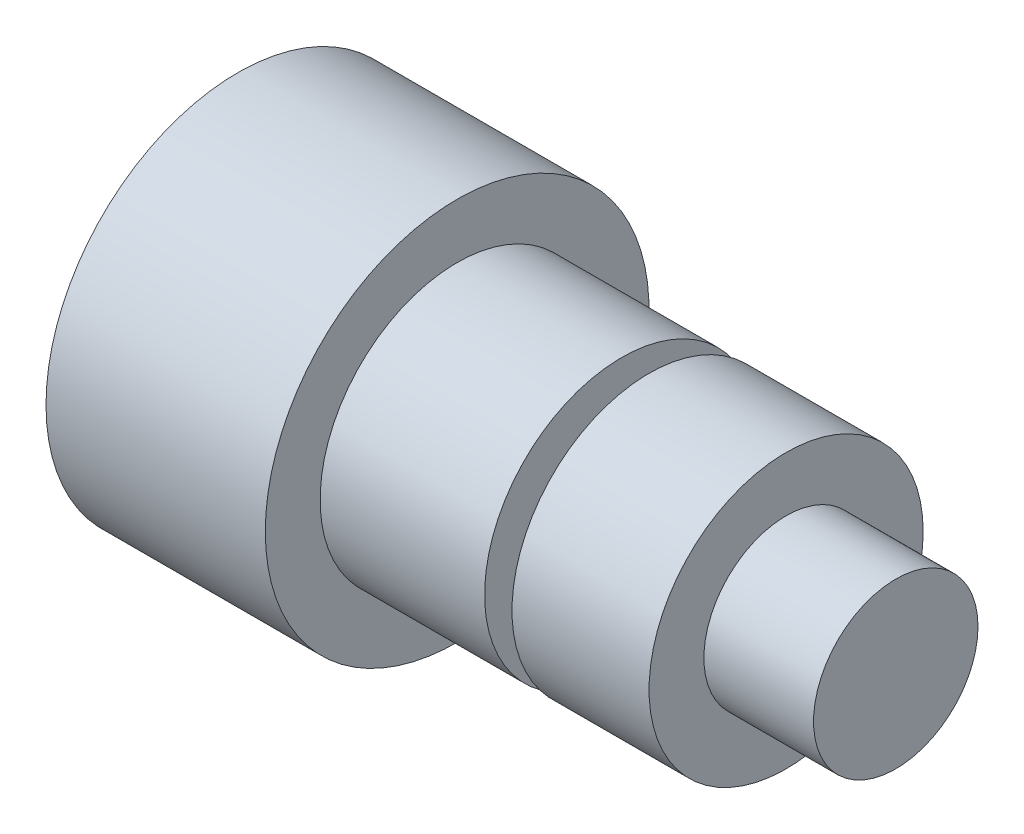
ISO-10303-21;
HEADER;
FILE_DESCRIPTION(('STEP AP214'),'2;1');
FILE_NAME('part.step','',(''),(''),'','','');
FILE_SCHEMA(('AUTOMOTIVE_DESIGN { 1 0 10303 214 1 1 1 1 }'));
ENDSEC;
DATA;
#1=APPLICATION_CONTEXT('core data for automotive mechanical design processes');
#2=APPLICATION_PROTOCOL_DEFINITION('international standard','automotive_design',2000,#1);
#3=PRODUCT_CONTEXT('',#1,'mechanical');
#4=PRODUCT('Part','Part','',(#3));
#5=PRODUCT_RELATED_PRODUCT_CATEGORY('part','',(#4));
#6=PRODUCT_DEFINITION_FORMATION('','',#4);
#7=PRODUCT_DEFINITION_CONTEXT('part definition',#1,'design');
#8=PRODUCT_DEFINITION('design','',#6,#7);
#9=PRODUCT_DEFINITION_SHAPE('','',#8);
#10=(LENGTH_UNIT() NAMED_UNIT(*) SI_UNIT(.MILLI.,.METRE.));
#11=(NAMED_UNIT(*) PLANE_ANGLE_UNIT() SI_UNIT($,.RADIAN.));
#12=(NAMED_UNIT(*) SI_UNIT($,.STERADIAN.) SOLID_ANGLE_UNIT());
#13=UNCERTAINTY_MEASURE_WITH_UNIT(LENGTH_MEASURE(1.E-05),#10,'distance_accuracy_value','');
#14=(GEOMETRIC_REPRESENTATION_CONTEXT(3) GLOBAL_UNCERTAINTY_ASSIGNED_CONTEXT((#13)) GLOBAL_UNIT_ASSIGNED_CONTEXT((#10,
#11,#12)) REPRESENTATION_CONTEXT('',''));
#15=CARTESIAN_POINT('',(0.,0.,0.));
#16=DIRECTION('',(0.,0.,1.));
#17=DIRECTION('',(1.,0.,0.));
#18=AXIS2_PLACEMENT_3D('',#15,#16,#17);
#19=CARTESIAN_POINT('',(0.,0.,0.));
#20=DIRECTION('',(1.,0.,0.));
#21=DIRECTION('',(0.,0.,-1.));
#22=AXIS2_PLACEMENT_3D('',#19,#20,#21);
#23=CYLINDRICAL_SURFACE('',#22,31.75);
#24=CARTESIAN_POINT('',(95.25,0.,0.));
#25=DIRECTION('',(1.,0.,0.));
#26=DIRECTION('',(0.,0.,-1.));
#27=AXIS2_PLACEMENT_3D('',#24,#25,#26);
#28=CIRCLE('',#27,31.75);
#29=CARTESIAN_POINT('',(95.25,0.,-31.75));
#30=VERTEX_POINT('',#29);
#31=EDGE_CURVE('E51',#30,#30,#28,.F.);
#32=ORIENTED_EDGE('',*,*,#31,.F.);
#33=EDGE_LOOP('',(#32));
#34=FACE_BOUND('',#33,.T.);
#35=CARTESIAN_POINT('',(127.,0.,0.));
#36=DIRECTION('',(1.,0.,0.));
#37=DIRECTION('',(0.,0.,-1.));
#38=AXIS2_PLACEMENT_3D('',#35,#36,#37);
#39=CIRCLE('',#38,31.75);
#40=CARTESIAN_POINT('',(127.,0.,-31.75));
#41=VERTEX_POINT('',#40);
#42=EDGE_CURVE('E54',#41,#41,#39,.F.);
#43=ORIENTED_EDGE('',*,*,#42,.T.);
#44=EDGE_LOOP('',(#43));
#45=FACE_BOUND('',#44,.T.);
#46=ADVANCED_FACE('F30',(#34,#45),#23,.T.);
#47=CARTESIAN_POINT('',(50.8,0.,0.));
#48=DIRECTION('',(1.,0.,0.));
#49=DIRECTION('',(0.,0.,-1.));
#50=AXIS2_PLACEMENT_3D('',#47,#48,#49);
#51=CIRCLE('',#50,31.75);
#52=CARTESIAN_POINT('',(50.8,0.,-31.75));
#53=VERTEX_POINT('',#52);
#54=EDGE_CURVE('E43',#53,#53,#51,.T.);
#55=ORIENTED_EDGE('',*,*,#54,.T.);
#56=EDGE_LOOP('',(#55));
#57=FACE_BOUND('',#56,.T.);
#58=CARTESIAN_POINT('',(88.9,0.,0.));
#59=DIRECTION('',(1.,0.,0.));
#60=DIRECTION('',(0.,0.,-1.));
#61=AXIS2_PLACEMENT_3D('',#58,#59,#60);
#62=CIRCLE('',#61,31.75);
#63=CARTESIAN_POINT('',(88.9,0.,-31.75));
#64=VERTEX_POINT('',#63);
#65=EDGE_CURVE('E48',#64,#64,#62,.F.);
#66=ORIENTED_EDGE('',*,*,#65,.T.);
#67=EDGE_LOOP('',(#66));
#68=FACE_BOUND('',#67,.T.);
#69=ADVANCED_FACE('F88',(#57,#68),#23,.T.);
#70=CARTESIAN_POINT('',(152.4,0.,0.));
#71=DIRECTION('',(-1.,0.,0.));
#72=DIRECTION('',(0.,0.,1.));
#73=AXIS2_PLACEMENT_3D('',#70,#71,#72);
#74=CYLINDRICAL_SURFACE('',#73,44.45);
#75=CARTESIAN_POINT('',(50.8,0.,0.));
#76=DIRECTION('',(-1.,0.,0.));
#77=DIRECTION('',(0.,0.,1.));
#78=AXIS2_PLACEMENT_3D('',#75,#76,#77);
#79=CIRCLE('',#78,44.45);
#80=CARTESIAN_POINT('',(50.8,0.,44.45));
#81=VERTEX_POINT('',#80);
#82=EDGE_CURVE('E38',#81,#81,#79,.T.);
#83=CARTESIAN_POINT('',(0.,0.,0.));
#84=DIRECTION('',(1.,0.,0.));
#85=DIRECTION('',(0.,0.,-1.));
#86=AXIS2_PLACEMENT_3D('',#83,#84,#85);
#87=CIRCLE('',#86,44.45);
#88=CARTESIAN_POINT('',(0.,0.,44.45));
#89=VERTEX_POINT('',#88);
#90=EDGE_CURVE('E10',#89,#89,#87,.T.);
#91=CARTESIAN_POINT('',(50.8,0.,44.45));
#92=CARTESIAN_POINT('',(50.2708333333334,0.,44.45));
#93=CARTESIAN_POINT('',(49.7416666666667,0.,44.45));
#94=CARTESIAN_POINT('',(48.6833333333334,0.,44.45));
#95=CARTESIAN_POINT('',(48.1541666666667,0.,44.45));
#96=CARTESIAN_POINT('',(47.0958333333334,0.,44.45));
#97=CARTESIAN_POINT('',(46.5666666666667,0.,44.45));
#98=CARTESIAN_POINT('',(45.5083333333334,0.,44.45));
#99=CARTESIAN_POINT('',(44.9791666666667,0.,44.45));
#100=CARTESIAN_POINT('',(43.9208333333333,0.,44.45));
#101=CARTESIAN_POINT('',(43.3916666666667,0.,44.45));
#102=CARTESIAN_POINT('',(42.3333333333333,0.,44.45));
#103=CARTESIAN_POINT('',(41.8041666666667,0.,44.45));
#104=CARTESIAN_POINT('',(40.7458333333334,0.,44.45));
#105=CARTESIAN_POINT('',(40.2166666666667,0.,44.45));
#106=CARTESIAN_POINT('',(39.1583333333333,0.,44.45));
#107=CARTESIAN_POINT('',(38.6291666666667,0.,44.45));
#108=CARTESIAN_POINT('',(37.5708333333333,0.,44.45));
#109=CARTESIAN_POINT('',(37.0416666666667,0.,44.45));
#110=CARTESIAN_POINT('',(35.9833333333333,0.,44.45));
#111=CARTESIAN_POINT('',(35.4541666666667,0.,44.45));
#112=CARTESIAN_POINT('',(34.3958333333333,0.,44.45));
#113=CARTESIAN_POINT('',(33.8666666666667,0.,44.45));
#114=CARTESIAN_POINT('',(32.8083333333333,0.,44.45));
#115=CARTESIAN_POINT('',(32.2791666666667,0.,44.45));
#116=CARTESIAN_POINT('',(31.2208333333333,0.,44.45));
#117=CARTESIAN_POINT('',(30.6916666666667,0.,44.45));
#118=CARTESIAN_POINT('',(29.6333333333333,0.,44.45));
#119=CARTESIAN_POINT('',(29.1041666666667,0.,44.45));
#120=CARTESIAN_POINT('',(28.0458333333333,0.,44.45));
#121=CARTESIAN_POINT('',(27.5166666666667,0.,44.45));
#122=CARTESIAN_POINT('',(26.4583333333334,0.,44.45));
#123=CARTESIAN_POINT('',(25.9291666666667,0.,44.45));
#124=CARTESIAN_POINT('',(24.8708333333334,0.,44.45));
#125=CARTESIAN_POINT('',(24.3416666666667,0.,44.45));
#126=CARTESIAN_POINT('',(23.2833333333333,0.,44.45));
#127=CARTESIAN_POINT('',(22.7541666666667,0.,44.45));
#128=CARTESIAN_POINT('',(21.6958333333334,0.,44.45));
#129=CARTESIAN_POINT('',(21.1666666666667,0.,44.45));
#130=CARTESIAN_POINT('',(20.1083333333334,0.,44.45));
#131=CARTESIAN_POINT('',(19.5791666666667,0.,44.45));
#132=CARTESIAN_POINT('',(18.5208333333333,0.,44.45));
#133=CARTESIAN_POINT('',(17.9916666666667,0.,44.45));
#134=CARTESIAN_POINT('',(16.9333333333334,0.,44.45));
#135=CARTESIAN_POINT('',(16.4041666666667,0.,44.45));
#136=CARTESIAN_POINT('',(15.3458333333334,0.,44.45));
#137=CARTESIAN_POINT('',(14.8166666666667,0.,44.45));
#138=CARTESIAN_POINT('',(13.7583333333333,0.,44.45));
#139=CARTESIAN_POINT('',(13.2291666666667,0.,44.45));
#140=CARTESIAN_POINT('',(12.1708333333334,0.,44.45));
#141=CARTESIAN_POINT('',(11.6416666666667,0.,44.45));
#142=CARTESIAN_POINT('',(10.5833333333334,0.,44.45));
#143=CARTESIAN_POINT('',(10.0541666666667,0.,44.45));
#144=CARTESIAN_POINT('',(8.99583333333334,0.,44.45));
#145=CARTESIAN_POINT('',(8.46666666666668,0.,44.45));
#146=CARTESIAN_POINT('',(7.40833333333335,0.,44.45));
#147=CARTESIAN_POINT('',(6.87916666666669,0.,44.45));
#148=CARTESIAN_POINT('',(5.82083333333335,0.,44.45));
#149=CARTESIAN_POINT('',(5.29166666666668,0.,44.45));
#150=CARTESIAN_POINT('',(4.23333333333334,0.,44.45));
#151=CARTESIAN_POINT('',(3.70416666666668,0.,44.45));
#152=CARTESIAN_POINT('',(2.64583333333334,0.,44.45));
#153=CARTESIAN_POINT('',(2.11666666666666,0.,44.45));
#154=CARTESIAN_POINT('',(1.05833333333333,0.,44.45));
#155=CARTESIAN_POINT('',(0.529166666666663,0.,44.45));
#156=CARTESIAN_POINT('',(0.,0.,44.45));
#157=B_SPLINE_CURVE_WITH_KNOTS('',3,(#91,#92,#93,#94,#95,#96,#97,#98,#99,#100,#101,#102,#103,
#104,#105,#106,#107,#108,#109,#110,#111,#112,#113,#114,#115,#116,#117,#118,#119,#120,#121,#122,
#123,#124,#125,#126,#127,#128,#129,#130,#131,#132,#133,#134,#135,#136,#137,#138,#139,#140,#141,
#142,#143,#144,#145,#146,#147,#148,#149,#150,#151,#152,#153,#154,#155,#156),.UNSPECIFIED.,.F.,
.F.,(4,2,2,2,2,2,2,2,2,2,2,2,2,2,2,2,2,2,2,2,2,2,2,2,2,2,2,2,2,2,2,2,4),(0.,1.58750000000001,
3.175,4.7625,6.35000000000001,7.93750000000001,9.52500000000001,11.1125,12.7,14.2875,15.875,
17.4625,19.05,20.6375,22.225,23.8125,25.4,26.9875,28.575,30.1625,31.75,33.3375,34.925,36.5125,
38.1,39.6875,41.275,42.8625,44.45,46.0375,47.625,49.2125,50.8),.UNSPECIFIED.);
#158=EDGE_CURVE('BSEAM32',#81,#89,#157,.T.);
#159=ORIENTED_EDGE('',*,*,#82,.T.);
#160=ORIENTED_EDGE('',*,*,#90,.T.);
#161=ORIENTED_EDGE('',*,*,#158,.T.);
#162=ORIENTED_EDGE('',*,*,#158,.F.);
#163=EDGE_LOOP('',(#159,#161,#160,#162));
#164=FACE_BOUND('',#163,.T.);
#165=ADVANCED_FACE('F32',(#164),#74,.T.);
#166=CARTESIAN_POINT('',(0.,0.,0.));
#167=DIRECTION('',(1.,0.,0.));
#168=DIRECTION('',(0.,0.,-1.));
#169=AXIS2_PLACEMENT_3D('',#166,#167,#168);
#170=PLANE('',#169);
#171=ORIENTED_EDGE('',*,*,#90,.F.);
#172=EDGE_LOOP('',(#171));
#173=FACE_BOUND('',#172,.T.);
#174=ADVANCED_FACE('F99',(#173),#170,.F.);
#175=CARTESIAN_POINT('',(50.8,64.2078530250238,0.));
#176=DIRECTION('',(-1.,0.,0.));
#177=DIRECTION('',(0.,0.,1.));
#178=AXIS2_PLACEMENT_3D('',#175,#176,#177);
#179=PLANE('',#178);
#180=ORIENTED_EDGE('',*,*,#54,.F.);
#181=EDGE_LOOP('',(#180));
#182=FACE_BOUND('',#181,.T.);
#183=ORIENTED_EDGE('',*,*,#82,.F.);
#184=EDGE_LOOP('',(#183));
#185=FACE_BOUND('',#184,.T.);
#186=ADVANCED_FACE('F84',(#182,#185),#179,.F.);
#187=CARTESIAN_POINT('',(95.25,22.225,0.));
#188=DIRECTION('',(1.,0.,0.));
#189=DIRECTION('',(0.,0.,-1.));
#190=AXIS2_PLACEMENT_3D('',#187,#188,#189);
#191=PLANE('',#190);
#192=ORIENTED_EDGE('',*,*,#31,.T.);
#193=EDGE_LOOP('',(#192));
#194=FACE_BOUND('',#193,.T.);
#195=CARTESIAN_POINT('',(95.25,0.,0.));
#196=DIRECTION('',(1.,0.,0.));
#197=DIRECTION('',(0.,0.,-1.));
#198=AXIS2_PLACEMENT_3D('',#195,#196,#197);
#199=CIRCLE('',#198,22.225);
#200=CARTESIAN_POINT('',(95.25,0.,-22.225));
#201=VERTEX_POINT('',#200);
#202=EDGE_CURVE('E52',#201,#201,#199,.T.);
#203=ORIENTED_EDGE('',*,*,#202,.T.);
#204=EDGE_LOOP('',(#203));
#205=FACE_BOUND('',#204,.T.);
#206=ADVANCED_FACE('F70',(#194,#205),#191,.F.);
#207=CARTESIAN_POINT('',(0.,0.,0.));
#208=DIRECTION('',(1.,0.,0.));
#209=DIRECTION('',(0.,0.,-1.));
#210=AXIS2_PLACEMENT_3D('',#207,#208,#209);
#211=CYLINDRICAL_SURFACE('',#210,22.225);
#212=CARTESIAN_POINT('',(88.9,0.,0.));
#213=DIRECTION('',(1.,0.,0.));
#214=DIRECTION('',(0.,0.,-1.));
#215=AXIS2_PLACEMENT_3D('',#212,#213,#214);
#216=CIRCLE('',#215,22.225);
#217=CARTESIAN_POINT('',(88.9,0.,-22.225));
#218=VERTEX_POINT('',#217);
#219=EDGE_CURVE('E60',#218,#218,#216,.T.);
#220=ORIENTED_EDGE('',*,*,#219,.T.);
#221=EDGE_LOOP('',(#220));
#222=FACE_BOUND('',#221,.T.);
#223=ORIENTED_EDGE('',*,*,#202,.F.);
#224=EDGE_LOOP('',(#223));
#225=FACE_BOUND('',#224,.T.);
#226=ADVANCED_FACE('F72',(#222,#225),#211,.T.);
#227=CARTESIAN_POINT('',(88.9,22.225,0.));
#228=DIRECTION('',(1.,0.,0.));
#229=DIRECTION('',(0.,0.,-1.));
#230=AXIS2_PLACEMENT_3D('',#227,#228,#229);
#231=PLANE('',#230);
#232=ORIENTED_EDGE('',*,*,#65,.F.);
#233=EDGE_LOOP('',(#232));
#234=FACE_BOUND('',#233,.T.);
#235=ORIENTED_EDGE('',*,*,#219,.F.);
#236=EDGE_LOOP('',(#235));
#237=FACE_BOUND('',#236,.T.);
#238=ADVANCED_FACE('F74',(#234,#237),#231,.T.);
#239=CARTESIAN_POINT('',(127.,19.05,0.));
#240=DIRECTION('',(1.,0.,0.));
#241=DIRECTION('',(0.,0.,-1.));
#242=AXIS2_PLACEMENT_3D('',#239,#240,#241);
#243=PLANE('',#242);
#244=ORIENTED_EDGE('',*,*,#42,.F.);
#245=EDGE_LOOP('',(#244));
#246=FACE_BOUND('',#245,.T.);
#247=CARTESIAN_POINT('',(127.,0.,0.));
#248=DIRECTION('',(1.,0.,0.));
#249=DIRECTION('',(0.,0.,-1.));
#250=AXIS2_PLACEMENT_3D('',#247,#248,#249);
#251=CIRCLE('',#250,19.05);
#252=CARTESIAN_POINT('',(127.,0.,-19.05));
#253=VERTEX_POINT('',#252);
#254=EDGE_CURVE('E56',#253,#253,#251,.T.);
#255=ORIENTED_EDGE('',*,*,#254,.F.);
#256=EDGE_LOOP('',(#255));
#257=FACE_BOUND('',#256,.T.);
#258=ADVANCED_FACE('F81',(#246,#257),#243,.T.);
#259=CARTESIAN_POINT('',(0.,0.,0.));
#260=DIRECTION('',(1.,0.,0.));
#261=DIRECTION('',(0.,0.,-1.));
#262=AXIS2_PLACEMENT_3D('',#259,#260,#261);
#263=CYLINDRICAL_SURFACE('',#262,19.05);
#264=CARTESIAN_POINT('',(152.4,0.,0.));
#265=DIRECTION('',(1.,0.,0.));
#266=DIRECTION('',(0.,0.,-1.));
#267=AXIS2_PLACEMENT_3D('',#264,#265,#266);
#268=CIRCLE('',#267,19.05);
#269=CARTESIAN_POINT('',(152.4,0.,-19.05));
#270=VERTEX_POINT('',#269);
#271=EDGE_CURVE('E34',#270,#270,#268,.F.);
#272=ORIENTED_EDGE('',*,*,#271,.T.);
#273=EDGE_LOOP('',(#272));
#274=FACE_BOUND('',#273,.T.);
#275=ORIENTED_EDGE('',*,*,#254,.T.);
#276=EDGE_LOOP('',(#275));
#277=FACE_BOUND('',#276,.T.);
#278=ADVANCED_FACE('F103',(#274,#277),#263,.T.);
#279=CARTESIAN_POINT('',(152.4,0.,0.));
#280=DIRECTION('',(1.,0.,0.));
#281=DIRECTION('',(0.,0.,-1.));
#282=AXIS2_PLACEMENT_3D('',#279,#280,#281);
#283=PLANE('',#282);
#284=ORIENTED_EDGE('',*,*,#271,.F.);
#285=EDGE_LOOP('',(#284));
#286=FACE_BOUND('',#285,.T.);
#287=ADVANCED_FACE('F101',(#286),#283,.T.);
#288=CLOSED_SHELL('',(#46,#69,#165,#174,#186,#206,#226,#238,#258,#278,#287));
#289=MANIFOLD_SOLID_BREP('B2',#288);
#290=ADVANCED_BREP_SHAPE_REPRESENTATION('',(#18,#289),#14);
#291=SHAPE_DEFINITION_REPRESENTATION(#9,#290);
ENDSEC;
END-ISO-10303-21;
